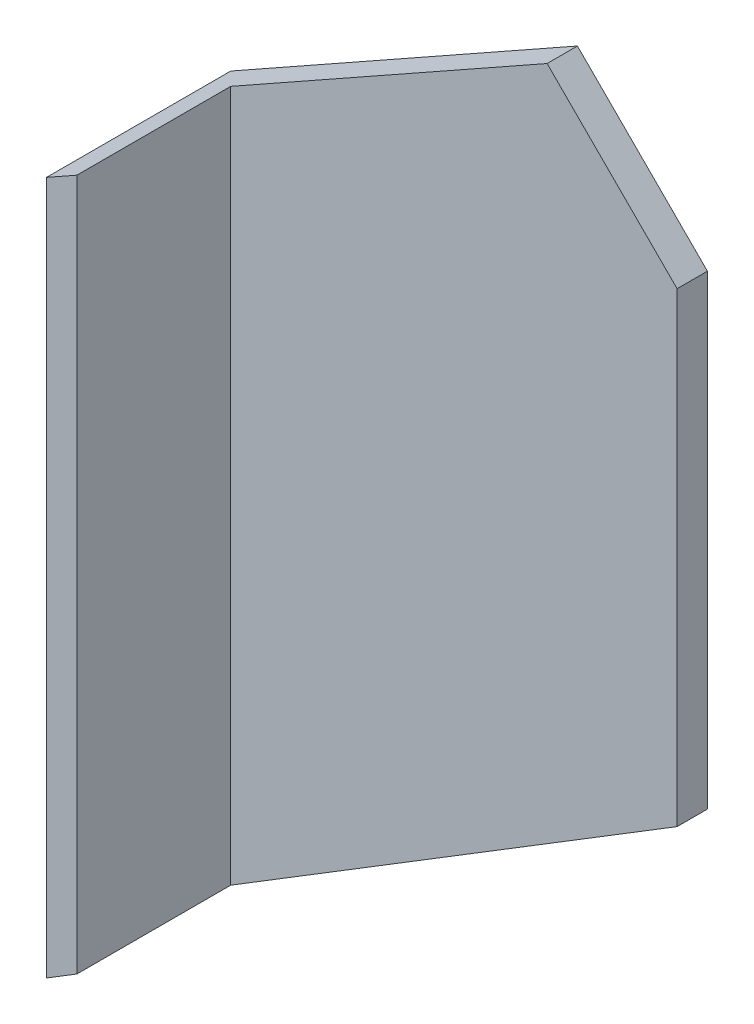
ISO-10303-21;
HEADER;
FILE_DESCRIPTION(('STEP AP214'),'2;1');
FILE_NAME('part.step','',(''),(''),'','','');
FILE_SCHEMA(('AUTOMOTIVE_DESIGN { 1 0 10303 214 1 1 1 1 }'));
ENDSEC;
DATA;
#1=APPLICATION_CONTEXT('core data for automotive mechanical design processes');
#2=APPLICATION_PROTOCOL_DEFINITION('international standard','automotive_design',2000,#1);
#3=PRODUCT_CONTEXT('',#1,'mechanical');
#4=PRODUCT('Part','Part','',(#3));
#5=PRODUCT_RELATED_PRODUCT_CATEGORY('part','',(#4));
#6=PRODUCT_DEFINITION_FORMATION('','',#4);
#7=PRODUCT_DEFINITION_CONTEXT('part definition',#1,'design');
#8=PRODUCT_DEFINITION('design','',#6,#7);
#9=PRODUCT_DEFINITION_SHAPE('','',#8);
#10=(LENGTH_UNIT() NAMED_UNIT(*) SI_UNIT(.MILLI.,.METRE.));
#11=(NAMED_UNIT(*) PLANE_ANGLE_UNIT() SI_UNIT($,.RADIAN.));
#12=(NAMED_UNIT(*) SI_UNIT($,.STERADIAN.) SOLID_ANGLE_UNIT());
#13=UNCERTAINTY_MEASURE_WITH_UNIT(LENGTH_MEASURE(1.E-05),#10,'distance_accuracy_value','');
#14=(GEOMETRIC_REPRESENTATION_CONTEXT(3) GLOBAL_UNCERTAINTY_ASSIGNED_CONTEXT((#13)) GLOBAL_UNIT_ASSIGNED_CONTEXT((#10,
#11,#12)) REPRESENTATION_CONTEXT('',''));
#15=CARTESIAN_POINT('',(0.,0.,0.));
#16=DIRECTION('',(0.,0.,1.));
#17=DIRECTION('',(1.,0.,0.));
#18=AXIS2_PLACEMENT_3D('',#15,#16,#17);
#19=CARTESIAN_POINT('',(-119.656440363729,-63.3766663723846,14.));
#20=DIRECTION('',(-0.52301621985259,0.852322728648666,0.));
#21=DIRECTION('',(-0.852322728648666,-0.52301621985259,0.));
#22=AXIS2_PLACEMENT_3D('',#19,#20,#21);
#23=PLANE('',#22);
#24=DIRECTION('',(0.852322728648666,0.52301621985259,0.));
#25=VECTOR('',#24,1.);
#26=CARTESIAN_POINT('',(-119.656440363729,-63.3766663723846,0.));
#27=LINE('',#26,#25);
#28=CARTESIAN_POINT('',(-119.656440363729,-63.3766663723846,0.));
#29=VERTEX_POINT('',#28);
#30=CARTESIAN_POINT('',(100.343559636271,71.6233336276154,0.));
#31=VERTEX_POINT('',#30);
#32=EDGE_CURVE('E141',#29,#31,#27,.T.);
#33=ORIENTED_EDGE('',*,*,#32,.T.);
#34=DIRECTION('',(0.,0.,-1.));
#35=VECTOR('',#34,1.);
#36=CARTESIAN_POINT('',(100.343559636271,71.6233336276154,14.));
#37=LINE('',#36,#35);
#38=CARTESIAN_POINT('',(100.343559636271,71.6233336276154,14.));
#39=VERTEX_POINT('',#38);
#40=EDGE_CURVE('E11',#39,#31,#37,.T.);
#41=ORIENTED_EDGE('',*,*,#40,.F.);
#42=DIRECTION('',(0.852322728648666,0.52301621985259,0.));
#43=VECTOR('',#42,1.);
#44=CARTESIAN_POINT('',(-119.656440363729,-63.3766663723846,14.));
#45=LINE('',#44,#43);
#46=CARTESIAN_POINT('',(-105.656440363729,-54.7857572814754,14.));
#47=VERTEX_POINT('',#46);
#48=EDGE_CURVE('E83',#47,#39,#45,.T.);
#49=ORIENTED_EDGE('',*,*,#48,.F.);
#50=DIRECTION('',(0.,0.,-1.));
#51=VECTOR('',#50,1.);
#52=CARTESIAN_POINT('',(-105.656440363729,-54.7857572814754,85.));
#53=LINE('',#52,#51);
#54=CARTESIAN_POINT('',(-105.656440363729,-54.7857572814754,85.));
#55=VERTEX_POINT('',#54);
#56=EDGE_CURVE('E138',#55,#47,#53,.T.);
#57=ORIENTED_EDGE('',*,*,#56,.F.);
#58=DIRECTION('',(0.852322728648666,0.52301621985259,0.));
#59=VECTOR('',#58,1.);
#60=CARTESIAN_POINT('',(-119.656440363729,-63.3766663723846,85.));
#61=LINE('',#60,#59);
#62=CARTESIAN_POINT('',(-119.656440363729,-63.3766663723846,85.));
#63=VERTEX_POINT('',#62);
#64=EDGE_CURVE('E116',#63,#55,#61,.T.);
#65=ORIENTED_EDGE('',*,*,#64,.F.);
#66=DIRECTION('',(0.,0.,-1.));
#67=VECTOR('',#66,1.);
#68=CARTESIAN_POINT('',(-119.656440363729,-63.3766663723846,14.));
#69=LINE('',#68,#67);
#70=EDGE_CURVE('E109',#63,#29,#69,.T.);
#71=ORIENTED_EDGE('',*,*,#70,.T.);
#72=EDGE_LOOP('',(#33,#41,#49,#57,#65,#71));
#73=FACE_BOUND('',#72,.T.);
#74=ADVANCED_FACE('F34',(#73),#23,.F.);
#75=CARTESIAN_POINT('',(100.343559636271,71.6233336276154,14.));
#76=DIRECTION('',(-1.,0.,0.));
#77=DIRECTION('',(0.,0.,1.));
#78=AXIS2_PLACEMENT_3D('',#75,#76,#77);
#79=PLANE('',#78);
#80=DIRECTION('',(0.,1.,0.));
#81=VECTOR('',#80,1.);
#82=CARTESIAN_POINT('',(100.343559636271,71.6233336276154,0.));
#83=LINE('',#82,#81);
#84=CARTESIAN_POINT('',(100.343559636271,286.623333627615,0.));
#85=VERTEX_POINT('',#84);
#86=EDGE_CURVE('E145',#31,#85,#83,.T.);
#87=ORIENTED_EDGE('',*,*,#86,.T.);
#88=DIRECTION('',(0.,0.,-1.));
#89=VECTOR('',#88,1.);
#90=CARTESIAN_POINT('',(100.343559636271,286.623333627615,14.));
#91=LINE('',#90,#89);
#92=CARTESIAN_POINT('',(100.343559636271,286.623333627615,14.));
#93=VERTEX_POINT('',#92);
#94=EDGE_CURVE('E42',#93,#85,#91,.T.);
#95=ORIENTED_EDGE('',*,*,#94,.F.);
#96=DIRECTION('',(0.,1.,0.));
#97=VECTOR('',#96,1.);
#98=CARTESIAN_POINT('',(100.343559636271,71.6233336276154,14.));
#99=LINE('',#98,#97);
#100=EDGE_CURVE('E161',#39,#93,#99,.T.);
#101=ORIENTED_EDGE('',*,*,#100,.F.);
#102=ORIENTED_EDGE('',*,*,#40,.T.);
#103=EDGE_LOOP('',(#87,#95,#101,#102));
#104=FACE_BOUND('',#103,.T.);
#105=ADVANCED_FACE('F178',(#104),#79,.F.);
#106=CARTESIAN_POINT('',(100.343559636271,286.623333627615,14.));
#107=DIRECTION('',(-0.707106781186555,-0.70710678118654,0.));
#108=DIRECTION('',(0.70710678118654,-0.707106781186555,0.));
#109=AXIS2_PLACEMENT_3D('',#106,#107,#108);
#110=PLANE('',#109);
#111=DIRECTION('',(-0.70710678118654,0.707106781186555,0.));
#112=VECTOR('',#111,1.);
#113=CARTESIAN_POINT('',(100.343559636271,286.623333627615,0.));
#114=LINE('',#113,#112);
#115=CARTESIAN_POINT('',(40.3435596362774,346.62333362761,0.));
#116=VERTEX_POINT('',#115);
#117=EDGE_CURVE('E150',#85,#116,#114,.T.);
#118=ORIENTED_EDGE('',*,*,#117,.T.);
#119=DIRECTION('',(0.,0.,-1.));
#120=VECTOR('',#119,1.);
#121=CARTESIAN_POINT('',(40.3435596362774,346.62333362761,14.));
#122=LINE('',#121,#120);
#123=CARTESIAN_POINT('',(40.3435596362774,346.62333362761,14.));
#124=VERTEX_POINT('',#123);
#125=EDGE_CURVE('E108',#124,#116,#122,.T.);
#126=ORIENTED_EDGE('',*,*,#125,.F.);
#127=DIRECTION('',(-0.70710678118654,0.707106781186555,0.));
#128=VECTOR('',#127,1.);
#129=CARTESIAN_POINT('',(100.343559636271,286.623333627615,14.));
#130=LINE('',#129,#128);
#131=EDGE_CURVE('E57',#93,#124,#130,.T.);
#132=ORIENTED_EDGE('',*,*,#131,.F.);
#133=ORIENTED_EDGE('',*,*,#94,.T.);
#134=EDGE_LOOP('',(#118,#126,#132,#133));
#135=FACE_BOUND('',#134,.T.);
#136=ADVANCED_FACE('F182',(#135),#110,.F.);
#137=CARTESIAN_POINT('',(40.3435596362774,346.62333362761,14.));
#138=DIRECTION('',(0.490261239632521,-0.87157553712457,0.));
#139=DIRECTION('',(0.87157553712457,0.490261239632521,0.));
#140=AXIS2_PLACEMENT_3D('',#137,#138,#139);
#141=PLANE('',#140);
#142=DIRECTION('',(-0.87157553712457,-0.490261239632521,0.));
#143=VECTOR('',#142,1.);
#144=CARTESIAN_POINT('',(40.3435596362774,346.62333362761,0.));
#145=LINE('',#144,#143);
#146=CARTESIAN_POINT('',(-119.656440363729,256.623333627615,0.));
#147=VERTEX_POINT('',#146);
#148=EDGE_CURVE('E107',#116,#147,#145,.T.);
#149=ORIENTED_EDGE('',*,*,#148,.T.);
#150=DIRECTION('',(0.,0.,-1.));
#151=VECTOR('',#150,1.);
#152=CARTESIAN_POINT('',(-119.656440363729,256.623333627615,14.));
#153=LINE('',#152,#151);
#154=CARTESIAN_POINT('',(-119.656440363729,256.623333627615,85.));
#155=VERTEX_POINT('',#154);
#156=EDGE_CURVE('E99',#155,#147,#153,.T.);
#157=ORIENTED_EDGE('',*,*,#156,.F.);
#158=DIRECTION('',(-0.871575537124571,-0.490261239632521,0.));
#159=VECTOR('',#158,1.);
#160=CARTESIAN_POINT('',(-105.656440363729,264.498333627615,85.));
#161=LINE('',#160,#159);
#162=CARTESIAN_POINT('',(-105.656440363729,264.498333627615,85.));
#163=VERTEX_POINT('',#162);
#164=EDGE_CURVE('E104',#163,#155,#161,.T.);
#165=ORIENTED_EDGE('',*,*,#164,.F.);
#166=DIRECTION('',(0.,0.,-1.));
#167=VECTOR('',#166,1.);
#168=CARTESIAN_POINT('',(-105.656440363729,264.498333627615,85.));
#169=LINE('',#168,#167);
#170=CARTESIAN_POINT('',(-105.656440363729,264.498333627615,14.));
#171=VERTEX_POINT('',#170);
#172=EDGE_CURVE('E127',#163,#171,#169,.T.);
#173=ORIENTED_EDGE('',*,*,#172,.T.);
#174=DIRECTION('',(-0.87157553712457,-0.490261239632521,0.));
#175=VECTOR('',#174,1.);
#176=CARTESIAN_POINT('',(40.3435596362774,346.62333362761,14.));
#177=LINE('',#176,#175);
#178=EDGE_CURVE('E134',#124,#171,#177,.T.);
#179=ORIENTED_EDGE('',*,*,#178,.F.);
#180=ORIENTED_EDGE('',*,*,#125,.T.);
#181=EDGE_LOOP('',(#149,#157,#165,#173,#179,#180));
#182=FACE_BOUND('',#181,.T.);
#183=ADVANCED_FACE('F101',(#182),#141,.F.);
#184=CARTESIAN_POINT('',(-119.656440363729,-63.3766663723846,14.));
#185=DIRECTION('',(1.,0.,0.));
#186=DIRECTION('',(0.,1.,0.));
#187=AXIS2_PLACEMENT_3D('',#184,#185,#186);
#188=PLANE('',#187);
#189=DIRECTION('',(0.,-1.,0.));
#190=VECTOR('',#189,1.);
#191=CARTESIAN_POINT('',(-119.656440363729,-63.3766663723846,0.));
#192=LINE('',#191,#190);
#193=EDGE_CURVE('E81',#147,#29,#192,.T.);
#194=ORIENTED_EDGE('',*,*,#193,.T.);
#195=ORIENTED_EDGE('',*,*,#70,.F.);
#196=DIRECTION('',(0.,-1.,0.));
#197=VECTOR('',#196,1.);
#198=CARTESIAN_POINT('',(-119.656440363729,256.623333627615,85.));
#199=LINE('',#198,#197);
#200=EDGE_CURVE('E112',#155,#63,#199,.T.);
#201=ORIENTED_EDGE('',*,*,#200,.F.);
#202=ORIENTED_EDGE('',*,*,#156,.T.);
#203=EDGE_LOOP('',(#194,#195,#201,#202));
#204=FACE_BOUND('',#203,.T.);
#205=ADVANCED_FACE('F113',(#204),#188,.F.);
#206=CARTESIAN_POINT('',(233.582996255987,153.383897007896,14.));
#207=DIRECTION('',(0.,0.,1.));
#208=DIRECTION('',(1.,0.,0.));
#209=AXIS2_PLACEMENT_3D('',#206,#207,#208);
#210=PLANE('',#209);
#211=DIRECTION('',(0.,1.,0.));
#212=VECTOR('',#211,1.);
#213=CARTESIAN_POINT('',(-105.656440363729,264.498333627615,14.));
#214=LINE('',#213,#212);
#215=EDGE_CURVE('E50',#47,#171,#214,.T.);
#216=ORIENTED_EDGE('',*,*,#215,.F.);
#217=ORIENTED_EDGE('',*,*,#48,.T.);
#218=ORIENTED_EDGE('',*,*,#100,.T.);
#219=ORIENTED_EDGE('',*,*,#131,.T.);
#220=ORIENTED_EDGE('',*,*,#178,.T.);
#221=EDGE_LOOP('',(#216,#217,#218,#219,#220));
#222=FACE_BOUND('',#221,.T.);
#223=ADVANCED_FACE('F164',(#222),#210,.T.);
#224=CARTESIAN_POINT('',(233.582996255987,153.383897007896,0.));
#225=DIRECTION('',(0.,0.,1.));
#226=DIRECTION('',(1.,0.,0.));
#227=AXIS2_PLACEMENT_3D('',#224,#225,#226);
#228=PLANE('',#227);
#229=ORIENTED_EDGE('',*,*,#32,.F.);
#230=ORIENTED_EDGE('',*,*,#193,.F.);
#231=ORIENTED_EDGE('',*,*,#148,.F.);
#232=ORIENTED_EDGE('',*,*,#117,.F.);
#233=ORIENTED_EDGE('',*,*,#86,.F.);
#234=EDGE_LOOP('',(#229,#230,#231,#232,#233));
#235=FACE_BOUND('',#234,.T.);
#236=ADVANCED_FACE('F167',(#235),#228,.F.);
#237=CARTESIAN_POINT('',(-105.656440363729,264.498333627615,85.));
#238=DIRECTION('',(-1.,0.,0.));
#239=DIRECTION('',(0.,-1.,0.));
#240=AXIS2_PLACEMENT_3D('',#237,#238,#239);
#241=PLANE('',#240);
#242=ORIENTED_EDGE('',*,*,#215,.T.);
#243=ORIENTED_EDGE('',*,*,#172,.F.);
#244=DIRECTION('',(0.,1.,0.));
#245=VECTOR('',#244,1.);
#246=CARTESIAN_POINT('',(-105.656440363729,264.498333627615,85.));
#247=LINE('',#246,#245);
#248=EDGE_CURVE('E120',#55,#163,#247,.T.);
#249=ORIENTED_EDGE('',*,*,#248,.F.);
#250=ORIENTED_EDGE('',*,*,#56,.T.);
#251=EDGE_LOOP('',(#242,#243,#249,#250));
#252=FACE_BOUND('',#251,.T.);
#253=ADVANCED_FACE('F165',(#252),#241,.F.);
#254=CARTESIAN_POINT('',(-119.656440363729,256.623333627615,85.));
#255=DIRECTION('',(0.,0.,1.));
#256=DIRECTION('',(1.,0.,0.));
#257=AXIS2_PLACEMENT_3D('',#254,#255,#256);
#258=PLANE('',#257);
#259=ORIENTED_EDGE('',*,*,#164,.T.);
#260=ORIENTED_EDGE('',*,*,#200,.T.);
#261=ORIENTED_EDGE('',*,*,#64,.T.);
#262=ORIENTED_EDGE('',*,*,#248,.T.);
#263=EDGE_LOOP('',(#259,#260,#261,#262));
#264=FACE_BOUND('',#263,.T.);
#265=ADVANCED_FACE('F118',(#264),#258,.T.);
#266=CLOSED_SHELL('',(#74,#105,#136,#183,#205,#223,#236,#253,#265));
#267=MANIFOLD_SOLID_BREP('B2',#266);
#268=ADVANCED_BREP_SHAPE_REPRESENTATION('',(#18,#267),#14);
#269=SHAPE_DEFINITION_REPRESENTATION(#9,#268);
ENDSEC;
END-ISO-10303-21;
